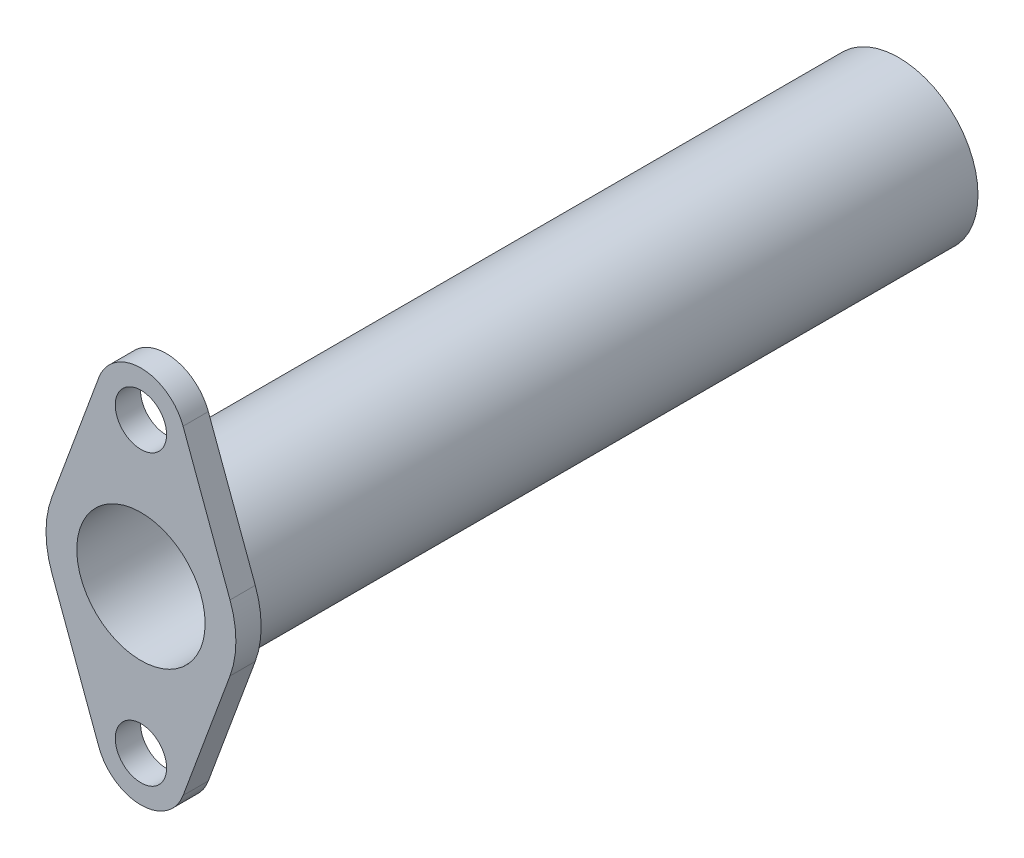
ISO-10303-21;
HEADER;
FILE_DESCRIPTION(('STEP AP214'),'2;1');
FILE_NAME('part.step','',(''),(''),'','','');
FILE_SCHEMA(('AUTOMOTIVE_DESIGN { 1 0 10303 214 1 1 1 1 }'));
ENDSEC;
DATA;
#1=APPLICATION_CONTEXT('core data for automotive mechanical design processes');
#2=APPLICATION_PROTOCOL_DEFINITION('international standard','automotive_design',2000,#1);
#3=PRODUCT_CONTEXT('',#1,'mechanical');
#4=PRODUCT('Part','Part','',(#3));
#5=PRODUCT_RELATED_PRODUCT_CATEGORY('part','',(#4));
#6=PRODUCT_DEFINITION_FORMATION('','',#4);
#7=PRODUCT_DEFINITION_CONTEXT('part definition',#1,'design');
#8=PRODUCT_DEFINITION('design','',#6,#7);
#9=PRODUCT_DEFINITION_SHAPE('','',#8);
#10=(LENGTH_UNIT() NAMED_UNIT(*) SI_UNIT(.MILLI.,.METRE.));
#11=(NAMED_UNIT(*) PLANE_ANGLE_UNIT() SI_UNIT($,.RADIAN.));
#12=(NAMED_UNIT(*) SI_UNIT($,.STERADIAN.) SOLID_ANGLE_UNIT());
#13=UNCERTAINTY_MEASURE_WITH_UNIT(LENGTH_MEASURE(1.E-05),#10,'distance_accuracy_value','');
#14=(GEOMETRIC_REPRESENTATION_CONTEXT(3) GLOBAL_UNCERTAINTY_ASSIGNED_CONTEXT((#13)) GLOBAL_UNIT_ASSIGNED_CONTEXT((#10,
#11,#12)) REPRESENTATION_CONTEXT('',''));
#15=CARTESIAN_POINT('',(0.,0.,0.));
#16=DIRECTION('',(0.,0.,1.));
#17=DIRECTION('',(1.,0.,0.));
#18=AXIS2_PLACEMENT_3D('',#15,#16,#17);
#19=CARTESIAN_POINT('',(17.6304298029616,6.51594666666668,-5.));
#20=DIRECTION('',(-0.937988391304616,-0.346666666666667,0.));
#21=DIRECTION('',(0.346666666666667,-0.937988391304616,0.));
#22=AXIS2_PLACEMENT_3D('',#19,#20,#21);
#23=PLANE('',#22);
#24=DIRECTION('',(0.346666666666667,-0.937988391304616,0.));
#25=VECTOR('',#24,1.);
#26=CARTESIAN_POINT('',(17.6304298029616,6.51594666666668,0.));
#27=LINE('',#26,#25);
#28=CARTESIAN_POINT('',(8.33871679869803,31.6568666666667,0.));
#29=VERTEX_POINT('',#28);
#30=CARTESIAN_POINT('',(17.6304298029616,6.51594666666668,0.));
#31=VERTEX_POINT('',#30);
#32=EDGE_CURVE('E140',#29,#31,#27,.T.);
#33=ORIENTED_EDGE('',*,*,#32,.T.);
#34=DIRECTION('',(0.,0.,1.));
#35=VECTOR('',#34,1.);
#36=CARTESIAN_POINT('',(17.6304298029616,6.51594666666668,-5.));
#37=LINE('',#36,#35);
#38=CARTESIAN_POINT('',(17.6304298029616,6.51594666666668,-5.));
#39=VERTEX_POINT('',#38);
#40=EDGE_CURVE('E11',#39,#31,#37,.T.);
#41=ORIENTED_EDGE('',*,*,#40,.F.);
#42=DIRECTION('',(0.346666666666667,-0.937988391304616,0.));
#43=VECTOR('',#42,1.);
#44=CARTESIAN_POINT('',(17.6304298029616,6.51594666666668,-5.));
#45=LINE('',#44,#43);
#46=CARTESIAN_POINT('',(8.33871679869803,31.6568666666667,-5.));
#47=VERTEX_POINT('',#46);
#48=EDGE_CURVE('E56',#47,#39,#45,.T.);
#49=ORIENTED_EDGE('',*,*,#48,.F.);
#50=DIRECTION('',(0.,0.,1.));
#51=VECTOR('',#50,1.);
#52=CARTESIAN_POINT('',(8.33871679869803,31.6568666666667,-5.));
#53=LINE('',#52,#51);
#54=EDGE_CURVE('E41',#47,#29,#53,.T.);
#55=ORIENTED_EDGE('',*,*,#54,.T.);
#56=EDGE_LOOP('',(#33,#41,#49,#55));
#57=FACE_BOUND('',#56,.T.);
#58=ADVANCED_FACE('F38',(#57),#23,.F.);
#59=CARTESIAN_POINT('',(0.,0.,-5.));
#60=DIRECTION('',(0.,0.,1.));
#61=DIRECTION('',(1.,0.,0.));
#62=AXIS2_PLACEMENT_3D('',#59,#60,#61);
#63=CYLINDRICAL_SURFACE('',#62,18.796);
#64=CARTESIAN_POINT('',(0.,0.,0.));
#65=DIRECTION('',(0.,0.,1.));
#66=DIRECTION('',(1.,0.,0.));
#67=AXIS2_PLACEMENT_3D('',#64,#65,#66);
#68=CIRCLE('',#67,18.796);
#69=CARTESIAN_POINT('',(17.6304298029616,-6.51594666666668,0.));
#70=VERTEX_POINT('',#69);
#71=EDGE_CURVE('E153',#70,#31,#68,.T.);
#72=ORIENTED_EDGE('',*,*,#71,.F.);
#73=DIRECTION('',(0.,0.,1.));
#74=VECTOR('',#73,1.);
#75=CARTESIAN_POINT('',(17.6304298029616,-6.51594666666668,-5.));
#76=LINE('',#75,#74);
#77=CARTESIAN_POINT('',(17.6304298029616,-6.51594666666668,-5.));
#78=VERTEX_POINT('',#77);
#79=EDGE_CURVE('E47',#78,#70,#76,.T.);
#80=ORIENTED_EDGE('',*,*,#79,.F.);
#81=CARTESIAN_POINT('',(0.,0.,-5.));
#82=DIRECTION('',(0.,0.,1.));
#83=DIRECTION('',(1.,0.,0.));
#84=AXIS2_PLACEMENT_3D('',#81,#82,#83);
#85=CIRCLE('',#84,18.796);
#86=EDGE_CURVE('E124',#78,#39,#85,.T.);
#87=ORIENTED_EDGE('',*,*,#86,.T.);
#88=ORIENTED_EDGE('',*,*,#40,.T.);
#89=EDGE_LOOP('',(#72,#80,#87,#88));
#90=FACE_BOUND('',#89,.T.);
#91=ADVANCED_FACE('F196',(#90),#63,.T.);
#92=CARTESIAN_POINT('',(17.6304298029616,-6.51594666666668,-5.));
#93=DIRECTION('',(0.937988391304616,-0.346666666666667,0.));
#94=DIRECTION('',(0.346666666666667,0.937988391304616,0.));
#95=AXIS2_PLACEMENT_3D('',#92,#93,#94);
#96=PLANE('',#95);
#97=DIRECTION('',(0.346666666666667,0.937988391304616,0.));
#98=VECTOR('',#97,1.);
#99=CARTESIAN_POINT('',(17.6304298029616,-6.51594666666668,0.));
#100=LINE('',#99,#98);
#101=CARTESIAN_POINT('',(8.33871679869803,-31.6568666666667,0.));
#102=VERTEX_POINT('',#101);
#103=EDGE_CURVE('E113',#102,#70,#100,.T.);
#104=ORIENTED_EDGE('',*,*,#103,.F.);
#105=DIRECTION('',(0.,0.,1.));
#106=VECTOR('',#105,1.);
#107=CARTESIAN_POINT('',(8.33871679869803,-31.6568666666667,-5.));
#108=LINE('',#107,#106);
#109=CARTESIAN_POINT('',(8.33871679869803,-31.6568666666667,-5.));
#110=VERTEX_POINT('',#109);
#111=EDGE_CURVE('E109',#110,#102,#108,.T.);
#112=ORIENTED_EDGE('',*,*,#111,.F.);
#113=DIRECTION('',(0.346666666666667,0.937988391304616,0.));
#114=VECTOR('',#113,1.);
#115=CARTESIAN_POINT('',(17.6304298029616,-6.51594666666668,-5.));
#116=LINE('',#115,#114);
#117=EDGE_CURVE('E112',#110,#78,#116,.T.);
#118=ORIENTED_EDGE('',*,*,#117,.T.);
#119=ORIENTED_EDGE('',*,*,#79,.T.);
#120=EDGE_LOOP('',(#104,#112,#118,#119));
#121=FACE_BOUND('',#120,.T.);
#122=ADVANCED_FACE('F111',(#121),#96,.T.);
#123=CARTESIAN_POINT('',(0.,-28.575,-5.));
#124=DIRECTION('',(0.,0.,1.));
#125=DIRECTION('',(1.,0.,0.));
#126=AXIS2_PLACEMENT_3D('',#123,#124,#125);
#127=CYLINDRICAL_SURFACE('',#126,8.89);
#128=CARTESIAN_POINT('',(0.,-28.575,0.));
#129=DIRECTION('',(0.,0.,1.));
#130=DIRECTION('',(1.,0.,0.));
#131=AXIS2_PLACEMENT_3D('',#128,#129,#130);
#132=CIRCLE('',#131,8.89);
#133=CARTESIAN_POINT('',(-8.33871679869803,-31.6568666666667,0.));
#134=VERTEX_POINT('',#133);
#135=EDGE_CURVE('E156',#134,#102,#132,.T.);
#136=ORIENTED_EDGE('',*,*,#135,.F.);
#137=DIRECTION('',(0.,0.,1.));
#138=VECTOR('',#137,1.);
#139=CARTESIAN_POINT('',(-8.33871679869803,-31.6568666666667,-5.));
#140=LINE('',#139,#138);
#141=CARTESIAN_POINT('',(-8.33871679869803,-31.6568666666667,-5.));
#142=VERTEX_POINT('',#141);
#143=EDGE_CURVE('E118',#142,#134,#140,.T.);
#144=ORIENTED_EDGE('',*,*,#143,.F.);
#145=CARTESIAN_POINT('',(0.,-28.575,-5.));
#146=DIRECTION('',(0.,0.,1.));
#147=DIRECTION('',(1.,0.,0.));
#148=AXIS2_PLACEMENT_3D('',#145,#146,#147);
#149=CIRCLE('',#148,8.89);
#150=EDGE_CURVE('E123',#142,#110,#149,.T.);
#151=ORIENTED_EDGE('',*,*,#150,.T.);
#152=ORIENTED_EDGE('',*,*,#111,.T.);
#153=EDGE_LOOP('',(#136,#144,#151,#152));
#154=FACE_BOUND('',#153,.T.);
#155=ADVANCED_FACE('F126',(#154),#127,.T.);
#156=CARTESIAN_POINT('',(-17.6304298029616,-6.51594666666668,-5.));
#157=DIRECTION('',(0.937988391304616,0.346666666666667,0.));
#158=DIRECTION('',(-0.346666666666667,0.937988391304616,0.));
#159=AXIS2_PLACEMENT_3D('',#156,#157,#158);
#160=PLANE('',#159);
#161=DIRECTION('',(-0.346666666666667,0.937988391304616,0.));
#162=VECTOR('',#161,1.);
#163=CARTESIAN_POINT('',(-17.6304298029616,-6.51594666666668,0.));
#164=LINE('',#163,#162);
#165=CARTESIAN_POINT('',(-17.6304298029616,-6.51594666666667,0.));
#166=VERTEX_POINT('',#165);
#167=EDGE_CURVE('E152',#134,#166,#164,.T.);
#168=ORIENTED_EDGE('',*,*,#167,.T.);
#169=DIRECTION('',(0.,0.,1.));
#170=VECTOR('',#169,1.);
#171=CARTESIAN_POINT('',(-17.6304298029616,-6.51594666666667,-5.));
#172=LINE('',#171,#170);
#173=CARTESIAN_POINT('',(-17.6304298029616,-6.51594666666667,-5.));
#174=VERTEX_POINT('',#173);
#175=EDGE_CURVE('E170',#174,#166,#172,.T.);
#176=ORIENTED_EDGE('',*,*,#175,.F.);
#177=DIRECTION('',(-0.346666666666667,0.937988391304616,0.));
#178=VECTOR('',#177,1.);
#179=CARTESIAN_POINT('',(-17.6304298029616,-6.51594666666668,-5.));
#180=LINE('',#179,#178);
#181=EDGE_CURVE('E128',#142,#174,#180,.T.);
#182=ORIENTED_EDGE('',*,*,#181,.F.);
#183=ORIENTED_EDGE('',*,*,#143,.T.);
#184=EDGE_LOOP('',(#168,#176,#182,#183));
#185=FACE_BOUND('',#184,.T.);
#186=ADVANCED_FACE('F208',(#185),#160,.F.);
#187=CARTESIAN_POINT('',(-17.6304298029616,6.51594666666667,0.));
#188=VERTEX_POINT('',#187);
#189=EDGE_CURVE('E149',#188,#166,#68,.T.);
#190=ORIENTED_EDGE('',*,*,#189,.F.);
#191=DIRECTION('',(0.,0.,1.));
#192=VECTOR('',#191,1.);
#193=CARTESIAN_POINT('',(-17.6304298029616,6.51594666666667,-5.));
#194=LINE('',#193,#192);
#195=CARTESIAN_POINT('',(-17.6304298029616,6.51594666666667,-5.));
#196=VERTEX_POINT('',#195);
#197=EDGE_CURVE('E172',#196,#188,#194,.T.);
#198=ORIENTED_EDGE('',*,*,#197,.F.);
#199=EDGE_CURVE('E130',#196,#174,#85,.T.);
#200=ORIENTED_EDGE('',*,*,#199,.T.);
#201=ORIENTED_EDGE('',*,*,#175,.T.);
#202=EDGE_LOOP('',(#190,#198,#200,#201));
#203=FACE_BOUND('',#202,.T.);
#204=ADVANCED_FACE('F201',(#203),#63,.T.);
#205=CARTESIAN_POINT('',(-17.6304298029616,6.51594666666668,-5.));
#206=DIRECTION('',(-0.937988391304616,0.346666666666667,0.));
#207=DIRECTION('',(-0.346666666666667,-0.937988391304616,0.));
#208=AXIS2_PLACEMENT_3D('',#205,#206,#207);
#209=PLANE('',#208);
#210=DIRECTION('',(-0.346666666666667,-0.937988391304616,0.));
#211=VECTOR('',#210,1.);
#212=CARTESIAN_POINT('',(-17.6304298029616,6.51594666666668,0.));
#213=LINE('',#212,#211);
#214=CARTESIAN_POINT('',(-8.33871679869803,31.6568666666667,0.));
#215=VERTEX_POINT('',#214);
#216=EDGE_CURVE('E146',#215,#188,#213,.T.);
#217=ORIENTED_EDGE('',*,*,#216,.F.);
#218=DIRECTION('',(0.,0.,1.));
#219=VECTOR('',#218,1.);
#220=CARTESIAN_POINT('',(-8.33871679869803,31.6568666666667,-5.));
#221=LINE('',#220,#219);
#222=CARTESIAN_POINT('',(-8.33871679869803,31.6568666666667,-5.));
#223=VERTEX_POINT('',#222);
#224=EDGE_CURVE('E173',#223,#215,#221,.T.);
#225=ORIENTED_EDGE('',*,*,#224,.F.);
#226=DIRECTION('',(-0.346666666666667,-0.937988391304616,0.));
#227=VECTOR('',#226,1.);
#228=CARTESIAN_POINT('',(-17.6304298029616,6.51594666666668,-5.));
#229=LINE('',#228,#227);
#230=EDGE_CURVE('E224',#223,#196,#229,.T.);
#231=ORIENTED_EDGE('',*,*,#230,.T.);
#232=ORIENTED_EDGE('',*,*,#197,.T.);
#233=EDGE_LOOP('',(#217,#225,#231,#232));
#234=FACE_BOUND('',#233,.T.);
#235=ADVANCED_FACE('F207',(#234),#209,.T.);
#236=CARTESIAN_POINT('',(0.,0.,-5.));
#237=DIRECTION('',(0.,0.,1.));
#238=DIRECTION('',(1.,0.,0.));
#239=AXIS2_PLACEMENT_3D('',#236,#237,#238);
#240=CYLINDRICAL_SURFACE('',#239,12.7);
#241=CARTESIAN_POINT('',(0.,0.,0.));
#242=DIRECTION('',(0.,0.,1.));
#243=DIRECTION('',(1.,0.,0.));
#244=AXIS2_PLACEMENT_3D('',#241,#242,#243);
#245=CIRCLE('',#244,12.7);
#246=CARTESIAN_POINT('',(12.7,0.,0.));
#247=VERTEX_POINT('',#246);
#248=EDGE_CURVE('E162',#247,#247,#245,.T.);
#249=ORIENTED_EDGE('',*,*,#248,.T.);
#250=EDGE_LOOP('',(#249));
#251=FACE_BOUND('',#250,.T.);
#252=CARTESIAN_POINT('',(0.,0.,-150.));
#253=DIRECTION('',(0.,0.,1.));
#254=DIRECTION('',(1.,0.,0.));
#255=AXIS2_PLACEMENT_3D('',#252,#253,#254);
#256=CIRCLE('',#255,12.7);
#257=CARTESIAN_POINT('',(12.7,0.,-150.));
#258=VERTEX_POINT('',#257);
#259=EDGE_CURVE('E235',#258,#258,#256,.T.);
#260=ORIENTED_EDGE('',*,*,#259,.F.);
#261=EDGE_LOOP('',(#260));
#262=FACE_BOUND('',#261,.T.);
#263=ADVANCED_FACE('F191',(#251,#262),#240,.F.);
#264=CARTESIAN_POINT('',(0.,28.575,-5.));
#265=DIRECTION('',(0.,0.,1.));
#266=DIRECTION('',(1.,0.,0.));
#267=AXIS2_PLACEMENT_3D('',#264,#265,#266);
#268=CYLINDRICAL_SURFACE('',#267,5.08);
#269=CARTESIAN_POINT('',(0.,28.575,-5.));
#270=DIRECTION('',(0.,0.,1.));
#271=DIRECTION('',(1.,0.,0.));
#272=AXIS2_PLACEMENT_3D('',#269,#270,#271);
#273=CIRCLE('',#272,5.08);
#274=CARTESIAN_POINT('',(5.08,28.575,-5.));
#275=VERTEX_POINT('',#274);
#276=EDGE_CURVE('E134',#275,#275,#273,.T.);
#277=ORIENTED_EDGE('',*,*,#276,.F.);
#278=EDGE_LOOP('',(#277));
#279=FACE_BOUND('',#278,.T.);
#280=CARTESIAN_POINT('',(0.,28.575,0.));
#281=DIRECTION('',(0.,0.,1.));
#282=DIRECTION('',(1.,0.,0.));
#283=AXIS2_PLACEMENT_3D('',#280,#281,#282);
#284=CIRCLE('',#283,5.08);
#285=CARTESIAN_POINT('',(5.08,28.575,0.));
#286=VERTEX_POINT('',#285);
#287=EDGE_CURVE('E159',#286,#286,#284,.T.);
#288=ORIENTED_EDGE('',*,*,#287,.T.);
#289=EDGE_LOOP('',(#288));
#290=FACE_BOUND('',#289,.T.);
#291=ADVANCED_FACE('F184',(#279,#290),#268,.F.);
#292=CARTESIAN_POINT('',(0.,28.575,-5.));
#293=DIRECTION('',(0.,0.,1.));
#294=DIRECTION('',(1.,0.,0.));
#295=AXIS2_PLACEMENT_3D('',#292,#293,#294);
#296=CYLINDRICAL_SURFACE('',#295,8.89);
#297=CARTESIAN_POINT('',(0.,28.575,0.));
#298=DIRECTION('',(0.,0.,1.));
#299=DIRECTION('',(1.,0.,0.));
#300=AXIS2_PLACEMENT_3D('',#297,#298,#299);
#301=CIRCLE('',#300,8.89);
#302=EDGE_CURVE('E142',#29,#215,#301,.T.);
#303=ORIENTED_EDGE('',*,*,#302,.F.);
#304=ORIENTED_EDGE('',*,*,#54,.F.);
#305=CARTESIAN_POINT('',(0.,28.575,-5.));
#306=DIRECTION('',(0.,0.,1.));
#307=DIRECTION('',(1.,0.,0.));
#308=AXIS2_PLACEMENT_3D('',#305,#306,#307);
#309=CIRCLE('',#308,8.89);
#310=EDGE_CURVE('E225',#47,#223,#309,.T.);
#311=ORIENTED_EDGE('',*,*,#310,.T.);
#312=ORIENTED_EDGE('',*,*,#224,.T.);
#313=EDGE_LOOP('',(#303,#304,#311,#312));
#314=FACE_BOUND('',#313,.T.);
#315=ADVANCED_FACE('F181',(#314),#296,.T.);
#316=CARTESIAN_POINT('',(0.,-28.575,-5.));
#317=DIRECTION('',(0.,0.,1.));
#318=DIRECTION('',(1.,0.,0.));
#319=AXIS2_PLACEMENT_3D('',#316,#317,#318);
#320=CYLINDRICAL_SURFACE('',#319,5.08);
#321=CARTESIAN_POINT('',(0.,-28.575,-5.));
#322=DIRECTION('',(0.,0.,1.));
#323=DIRECTION('',(1.,0.,0.));
#324=AXIS2_PLACEMENT_3D('',#321,#322,#323);
#325=CIRCLE('',#324,5.08);
#326=CARTESIAN_POINT('',(5.08,-28.575,-5.));
#327=VERTEX_POINT('',#326);
#328=EDGE_CURVE('E137',#327,#327,#325,.T.);
#329=ORIENTED_EDGE('',*,*,#328,.F.);
#330=EDGE_LOOP('',(#329));
#331=FACE_BOUND('',#330,.T.);
#332=CARTESIAN_POINT('',(0.,-28.575,0.));
#333=DIRECTION('',(0.,0.,1.));
#334=DIRECTION('',(1.,0.,0.));
#335=AXIS2_PLACEMENT_3D('',#332,#333,#334);
#336=CIRCLE('',#335,5.08);
#337=CARTESIAN_POINT('',(5.08,-28.575,0.));
#338=VERTEX_POINT('',#337);
#339=EDGE_CURVE('E165',#338,#338,#336,.T.);
#340=ORIENTED_EDGE('',*,*,#339,.T.);
#341=EDGE_LOOP('',(#340));
#342=FACE_BOUND('',#341,.T.);
#343=ADVANCED_FACE('F183',(#331,#342),#320,.F.);
#344=CARTESIAN_POINT('',(0.,0.,-5.));
#345=DIRECTION('',(0.,0.,1.));
#346=DIRECTION('',(1.,0.,0.));
#347=AXIS2_PLACEMENT_3D('',#344,#345,#346);
#348=PLANE('',#347);
#349=CARTESIAN_POINT('',(0.,0.,-5.));
#350=DIRECTION('',(0.,0.,1.));
#351=DIRECTION('',(1.,0.,0.));
#352=AXIS2_PLACEMENT_3D('',#349,#350,#351);
#353=CIRCLE('',#352,15.7);
#354=CARTESIAN_POINT('',(15.7,0.,-5.));
#355=VERTEX_POINT('',#354);
#356=EDGE_CURVE('E143',#355,#355,#353,.T.);
#357=ORIENTED_EDGE('',*,*,#356,.T.);
#358=EDGE_LOOP('',(#357));
#359=FACE_BOUND('',#358,.T.);
#360=ORIENTED_EDGE('',*,*,#48,.T.);
#361=ORIENTED_EDGE('',*,*,#86,.F.);
#362=ORIENTED_EDGE('',*,*,#117,.F.);
#363=ORIENTED_EDGE('',*,*,#150,.F.);
#364=ORIENTED_EDGE('',*,*,#181,.T.);
#365=ORIENTED_EDGE('',*,*,#199,.F.);
#366=ORIENTED_EDGE('',*,*,#230,.F.);
#367=ORIENTED_EDGE('',*,*,#310,.F.);
#368=EDGE_LOOP('',(#360,#361,#362,#363,#364,#365,#366,#367));
#369=FACE_BOUND('',#368,.T.);
#370=ORIENTED_EDGE('',*,*,#276,.T.);
#371=EDGE_LOOP('',(#370));
#372=FACE_BOUND('',#371,.T.);
#373=ORIENTED_EDGE('',*,*,#328,.T.);
#374=EDGE_LOOP('',(#373));
#375=FACE_BOUND('',#374,.T.);
#376=ADVANCED_FACE('F121',(#359,#369,#372,#375),#348,.F.);
#377=CARTESIAN_POINT('',(0.,0.,0.));
#378=DIRECTION('',(0.,0.,1.));
#379=DIRECTION('',(1.,0.,0.));
#380=AXIS2_PLACEMENT_3D('',#377,#378,#379);
#381=PLANE('',#380);
#382=ORIENTED_EDGE('',*,*,#32,.F.);
#383=ORIENTED_EDGE('',*,*,#302,.T.);
#384=ORIENTED_EDGE('',*,*,#216,.T.);
#385=ORIENTED_EDGE('',*,*,#189,.T.);
#386=ORIENTED_EDGE('',*,*,#167,.F.);
#387=ORIENTED_EDGE('',*,*,#135,.T.);
#388=ORIENTED_EDGE('',*,*,#103,.T.);
#389=ORIENTED_EDGE('',*,*,#71,.T.);
#390=EDGE_LOOP('',(#382,#383,#384,#385,#386,#387,#388,#389));
#391=FACE_BOUND('',#390,.T.);
#392=ORIENTED_EDGE('',*,*,#287,.F.);
#393=EDGE_LOOP('',(#392));
#394=FACE_BOUND('',#393,.T.);
#395=ORIENTED_EDGE('',*,*,#339,.F.);
#396=EDGE_LOOP('',(#395));
#397=FACE_BOUND('',#396,.T.);
#398=ORIENTED_EDGE('',*,*,#248,.F.);
#399=EDGE_LOOP('',(#398));
#400=FACE_BOUND('',#399,.T.);
#401=ADVANCED_FACE('F179',(#391,#394,#397,#400),#381,.T.);
#402=CARTESIAN_POINT('',(0.,0.,-150.));
#403=DIRECTION('',(0.,0.,1.));
#404=DIRECTION('',(1.,0.,0.));
#405=AXIS2_PLACEMENT_3D('',#402,#403,#404);
#406=CYLINDRICAL_SURFACE('',#405,15.7);
#407=CARTESIAN_POINT('',(0.,0.,-150.));
#408=DIRECTION('',(0.,0.,1.));
#409=DIRECTION('',(1.,0.,0.));
#410=AXIS2_PLACEMENT_3D('',#407,#408,#409);
#411=CIRCLE('',#410,15.7);
#412=CARTESIAN_POINT('',(15.7,0.,-150.));
#413=VERTEX_POINT('',#412);
#414=EDGE_CURVE('E232',#413,#413,#411,.T.);
#415=ORIENTED_EDGE('',*,*,#414,.T.);
#416=EDGE_LOOP('',(#415));
#417=FACE_BOUND('',#416,.T.);
#418=ORIENTED_EDGE('',*,*,#356,.F.);
#419=EDGE_LOOP('',(#418));
#420=FACE_BOUND('',#419,.T.);
#421=ADVANCED_FACE('F250',(#417,#420),#406,.T.);
#422=CARTESIAN_POINT('',(0.,0.,-150.));
#423=DIRECTION('',(0.,0.,1.));
#424=DIRECTION('',(1.,0.,0.));
#425=AXIS2_PLACEMENT_3D('',#422,#423,#424);
#426=PLANE('',#425);
#427=ORIENTED_EDGE('',*,*,#259,.T.);
#428=EDGE_LOOP('',(#427));
#429=FACE_BOUND('',#428,.T.);
#430=ORIENTED_EDGE('',*,*,#414,.F.);
#431=EDGE_LOOP('',(#430));
#432=FACE_BOUND('',#431,.T.);
#433=ADVANCED_FACE('F239',(#429,#432),#426,.F.);
#434=CLOSED_SHELL('',(#58,#91,#122,#155,#186,#204,#235,#263,#291,#315,#343,#376,#401,#421,#433));
#435=MANIFOLD_SOLID_BREP('B2',#434);
#436=ADVANCED_BREP_SHAPE_REPRESENTATION('',(#18,#435),#14);
#437=SHAPE_DEFINITION_REPRESENTATION(#9,#436);
ENDSEC;
END-ISO-10303-21;
